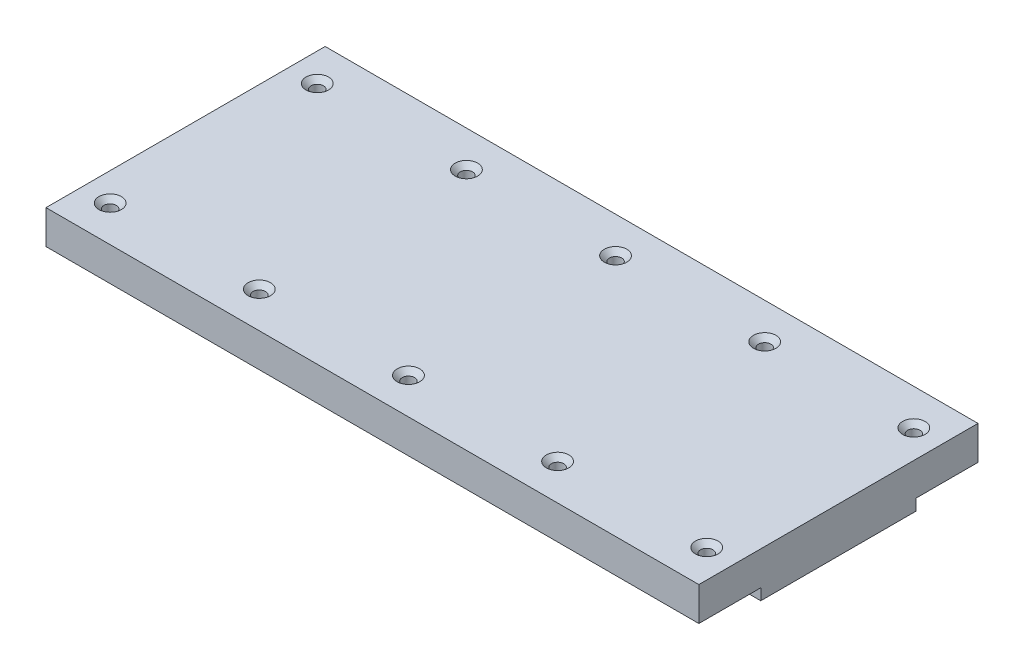
ISO-10303-21;
HEADER;
FILE_DESCRIPTION(('STEP AP214'),'2;1');
FILE_NAME('part.step','',(''),(''),'','','');
FILE_SCHEMA(('AUTOMOTIVE_DESIGN { 1 0 10303 214 1 1 1 1 }'));
ENDSEC;
DATA;
#1=APPLICATION_CONTEXT('core data for automotive mechanical design processes');
#2=APPLICATION_PROTOCOL_DEFINITION('international standard','automotive_design',2000,#1);
#3=PRODUCT_CONTEXT('',#1,'mechanical');
#4=PRODUCT('Part','Part','',(#3));
#5=PRODUCT_RELATED_PRODUCT_CATEGORY('part','',(#4));
#6=PRODUCT_DEFINITION_FORMATION('','',#4);
#7=PRODUCT_DEFINITION_CONTEXT('part definition',#1,'design');
#8=PRODUCT_DEFINITION('design','',#6,#7);
#9=PRODUCT_DEFINITION_SHAPE('','',#8);
#10=(LENGTH_UNIT() NAMED_UNIT(*) SI_UNIT(.MILLI.,.METRE.));
#11=(NAMED_UNIT(*) PLANE_ANGLE_UNIT() SI_UNIT($,.RADIAN.));
#12=(NAMED_UNIT(*) SI_UNIT($,.STERADIAN.) SOLID_ANGLE_UNIT());
#13=UNCERTAINTY_MEASURE_WITH_UNIT(LENGTH_MEASURE(1.E-05),#10,'distance_accuracy_value','');
#14=(GEOMETRIC_REPRESENTATION_CONTEXT(3) GLOBAL_UNCERTAINTY_ASSIGNED_CONTEXT((#13)) GLOBAL_UNIT_ASSIGNED_CONTEXT((#10,
#11,#12)) REPRESENTATION_CONTEXT('',''));
#15=CARTESIAN_POINT('',(0.,0.,0.));
#16=DIRECTION('',(0.,0.,1.));
#17=DIRECTION('',(1.,0.,0.));
#18=AXIS2_PLACEMENT_3D('',#15,#16,#17);
#19=CARTESIAN_POINT('',(290.,-30.,-124.));
#20=DIRECTION('',(0.,1.,0.));
#21=DIRECTION('',(0.,0.,1.));
#22=AXIS2_PLACEMENT_3D('',#19,#20,#21);
#23=PLANE('',#22);
#24=CARTESIAN_POINT('',(-265.,-30.,-92.));
#25=DIRECTION('',(0.,1.,0.));
#26=DIRECTION('',(0.,0.,1.));
#27=AXIS2_PLACEMENT_3D('',#24,#25,#26);
#28=CIRCLE('',#27,5.50000000000001);
#29=CARTESIAN_POINT('',(-265.,-30.,-86.5));
#30=VERTEX_POINT('',#29);
#31=EDGE_CURVE('E42',#30,#30,#28,.T.);
#32=ORIENTED_EDGE('',*,*,#31,.T.);
#33=EDGE_LOOP('',(#32));
#34=FACE_BOUND('',#33,.T.);
#35=CARTESIAN_POINT('',(-132.5,-30.,-92.));
#36=DIRECTION('',(0.,1.,0.));
#37=DIRECTION('',(0.,0.,1.));
#38=AXIS2_PLACEMENT_3D('',#35,#36,#37);
#39=CIRCLE('',#38,5.49999999999999);
#40=CARTESIAN_POINT('',(-132.5,-30.,-86.5));
#41=VERTEX_POINT('',#40);
#42=EDGE_CURVE('E228',#41,#41,#39,.T.);
#43=ORIENTED_EDGE('',*,*,#42,.T.);
#44=EDGE_LOOP('',(#43));
#45=FACE_BOUND('',#44,.T.);
#46=CARTESIAN_POINT('',(0.,-30.,-92.));
#47=DIRECTION('',(0.,1.,0.));
#48=DIRECTION('',(0.,0.,1.));
#49=AXIS2_PLACEMENT_3D('',#46,#47,#48);
#50=CIRCLE('',#49,5.49999999999999);
#51=CARTESIAN_POINT('',(0.,-30.,-86.5));
#52=VERTEX_POINT('',#51);
#53=EDGE_CURVE('E223',#52,#52,#50,.T.);
#54=ORIENTED_EDGE('',*,*,#53,.T.);
#55=EDGE_LOOP('',(#54));
#56=FACE_BOUND('',#55,.T.);
#57=CARTESIAN_POINT('',(132.5,-30.,-92.));
#58=DIRECTION('',(0.,1.,0.));
#59=DIRECTION('',(0.,0.,1.));
#60=AXIS2_PLACEMENT_3D('',#57,#58,#59);
#61=CIRCLE('',#60,5.49999999999999);
#62=CARTESIAN_POINT('',(132.5,-30.,-86.5));
#63=VERTEX_POINT('',#62);
#64=EDGE_CURVE('E217',#63,#63,#61,.T.);
#65=ORIENTED_EDGE('',*,*,#64,.T.);
#66=EDGE_LOOP('',(#65));
#67=FACE_BOUND('',#66,.T.);
#68=CARTESIAN_POINT('',(265.,-30.,-92.));
#69=DIRECTION('',(0.,1.,0.));
#70=DIRECTION('',(0.,0.,1.));
#71=AXIS2_PLACEMENT_3D('',#68,#69,#70);
#72=CIRCLE('',#71,5.50000000000001);
#73=CARTESIAN_POINT('',(265.,-30.,-86.5));
#74=VERTEX_POINT('',#73);
#75=EDGE_CURVE('E211',#74,#74,#72,.T.);
#76=ORIENTED_EDGE('',*,*,#75,.T.);
#77=EDGE_LOOP('',(#76));
#78=FACE_BOUND('',#77,.T.);
#79=DIRECTION('',(0.,0.,-1.));
#80=VECTOR('',#79,1.);
#81=CARTESIAN_POINT('',(-290.,-30.,-124.));
#82=LINE('',#81,#80);
#83=CARTESIAN_POINT('',(-290.,-30.,-69.));
#84=VERTEX_POINT('',#83);
#85=CARTESIAN_POINT('',(-290.,-30.,-124.));
#86=VERTEX_POINT('',#85);
#87=EDGE_CURVE('E142',#84,#86,#82,.T.);
#88=ORIENTED_EDGE('',*,*,#87,.T.);
#89=DIRECTION('',(-1.,0.,0.));
#90=VECTOR('',#89,1.);
#91=CARTESIAN_POINT('',(290.,-30.,-124.));
#92=LINE('',#91,#90);
#93=CARTESIAN_POINT('',(290.,-30.,-124.));
#94=VERTEX_POINT('',#93);
#95=EDGE_CURVE('E11',#94,#86,#92,.T.);
#96=ORIENTED_EDGE('',*,*,#95,.F.);
#97=DIRECTION('',(0.,0.,-1.));
#98=VECTOR('',#97,1.);
#99=CARTESIAN_POINT('',(290.,-30.,-124.));
#100=LINE('',#99,#98);
#101=CARTESIAN_POINT('',(290.,-30.,-69.));
#102=VERTEX_POINT('',#101);
#103=EDGE_CURVE('E165',#102,#94,#100,.T.);
#104=ORIENTED_EDGE('',*,*,#103,.F.);
#105=DIRECTION('',(-1.,0.,0.));
#106=VECTOR('',#105,1.);
#107=CARTESIAN_POINT('',(290.,-30.,-69.));
#108=LINE('',#107,#106);
#109=EDGE_CURVE('E138',#102,#84,#108,.T.);
#110=ORIENTED_EDGE('',*,*,#109,.T.);
#111=EDGE_LOOP('',(#88,#96,#104,#110));
#112=FACE_BOUND('',#111,.T.);
#113=ADVANCED_FACE('F39',(#34,#45,#56,#67,#78,#112),#23,.F.);
#114=CARTESIAN_POINT('',(290.,0.,-124.));
#115=DIRECTION('',(0.,0.,1.));
#116=DIRECTION('',(1.,0.,0.));
#117=AXIS2_PLACEMENT_3D('',#114,#115,#116);
#118=PLANE('',#117);
#119=DIRECTION('',(0.,1.,0.));
#120=VECTOR('',#119,1.);
#121=CARTESIAN_POINT('',(-290.,0.,-124.));
#122=LINE('',#121,#120);
#123=CARTESIAN_POINT('',(-290.,0.,-124.));
#124=VERTEX_POINT('',#123);
#125=EDGE_CURVE('E146',#86,#124,#122,.T.);
#126=ORIENTED_EDGE('',*,*,#125,.T.);
#127=DIRECTION('',(-1.,0.,0.));
#128=VECTOR('',#127,1.);
#129=CARTESIAN_POINT('',(290.,0.,-124.));
#130=LINE('',#129,#128);
#131=CARTESIAN_POINT('',(290.,0.,-124.));
#132=VERTEX_POINT('',#131);
#133=EDGE_CURVE('E49',#132,#124,#130,.T.);
#134=ORIENTED_EDGE('',*,*,#133,.F.);
#135=DIRECTION('',(0.,1.,0.));
#136=VECTOR('',#135,1.);
#137=CARTESIAN_POINT('',(290.,0.,-124.));
#138=LINE('',#137,#136);
#139=EDGE_CURVE('E101',#94,#132,#138,.T.);
#140=ORIENTED_EDGE('',*,*,#139,.F.);
#141=ORIENTED_EDGE('',*,*,#95,.T.);
#142=EDGE_LOOP('',(#126,#134,#140,#141));
#143=FACE_BOUND('',#142,.T.);
#144=ADVANCED_FACE('F332',(#143),#118,.F.);
#145=CARTESIAN_POINT('',(290.,0.,124.));
#146=DIRECTION('',(0.,-1.,0.));
#147=DIRECTION('',(0.,0.,-1.));
#148=AXIS2_PLACEMENT_3D('',#145,#146,#147);
#149=PLANE('',#148);
#150=CARTESIAN_POINT('',(-265.,0.,-92.));
#151=DIRECTION('',(0.,1.,0.));
#152=DIRECTION('',(0.,0.,1.));
#153=AXIS2_PLACEMENT_3D('',#150,#151,#152);
#154=CIRCLE('',#153,10.);
#155=CARTESIAN_POINT('',(-265.,0.,-82.));
#156=VERTEX_POINT('',#155);
#157=EDGE_CURVE('E542',#156,#156,#154,.T.);
#158=ORIENTED_EDGE('',*,*,#157,.F.);
#159=EDGE_LOOP('',(#158));
#160=FACE_BOUND('',#159,.T.);
#161=CARTESIAN_POINT('',(-132.5,0.,-92.));
#162=DIRECTION('',(0.,1.,0.));
#163=DIRECTION('',(0.,0.,1.));
#164=AXIS2_PLACEMENT_3D('',#161,#162,#163);
#165=CIRCLE('',#164,9.99999999999999);
#166=CARTESIAN_POINT('',(-132.5,0.,-82.));
#167=VERTEX_POINT('',#166);
#168=EDGE_CURVE('E240',#167,#167,#165,.T.);
#169=ORIENTED_EDGE('',*,*,#168,.F.);
#170=EDGE_LOOP('',(#169));
#171=FACE_BOUND('',#170,.T.);
#172=CARTESIAN_POINT('',(0.,0.,-92.));
#173=DIRECTION('',(0.,1.,0.));
#174=DIRECTION('',(0.,0.,1.));
#175=AXIS2_PLACEMENT_3D('',#172,#173,#174);
#176=CIRCLE('',#175,10.);
#177=CARTESIAN_POINT('',(0.,0.,-82.));
#178=VERTEX_POINT('',#177);
#179=EDGE_CURVE('E231',#178,#178,#176,.T.);
#180=ORIENTED_EDGE('',*,*,#179,.F.);
#181=EDGE_LOOP('',(#180));
#182=FACE_BOUND('',#181,.T.);
#183=CARTESIAN_POINT('',(132.5,0.,-92.));
#184=DIRECTION('',(0.,1.,0.));
#185=DIRECTION('',(0.,0.,1.));
#186=AXIS2_PLACEMENT_3D('',#183,#184,#185);
#187=CIRCLE('',#186,10.);
#188=CARTESIAN_POINT('',(132.5,0.,-82.));
#189=VERTEX_POINT('',#188);
#190=EDGE_CURVE('E226',#189,#189,#187,.T.);
#191=ORIENTED_EDGE('',*,*,#190,.F.);
#192=EDGE_LOOP('',(#191));
#193=FACE_BOUND('',#192,.T.);
#194=CARTESIAN_POINT('',(265.,0.,-92.));
#195=DIRECTION('',(0.,1.,0.));
#196=DIRECTION('',(0.,0.,1.));
#197=AXIS2_PLACEMENT_3D('',#194,#195,#196);
#198=CIRCLE('',#197,10.);
#199=CARTESIAN_POINT('',(265.,0.,-82.));
#200=VERTEX_POINT('',#199);
#201=EDGE_CURVE('E221',#200,#200,#198,.T.);
#202=ORIENTED_EDGE('',*,*,#201,.F.);
#203=EDGE_LOOP('',(#202));
#204=FACE_BOUND('',#203,.T.);
#205=CARTESIAN_POINT('',(265.,0.,92.));
#206=DIRECTION('',(0.,1.,0.));
#207=DIRECTION('',(0.,0.,1.));
#208=AXIS2_PLACEMENT_3D('',#205,#206,#207);
#209=CIRCLE('',#208,10.);
#210=CARTESIAN_POINT('',(265.,0.,102.));
#211=VERTEX_POINT('',#210);
#212=EDGE_CURVE('E215',#211,#211,#209,.T.);
#213=ORIENTED_EDGE('',*,*,#212,.F.);
#214=EDGE_LOOP('',(#213));
#215=FACE_BOUND('',#214,.T.);
#216=CARTESIAN_POINT('',(132.5,0.,92.));
#217=DIRECTION('',(0.,1.,0.));
#218=DIRECTION('',(0.,0.,1.));
#219=AXIS2_PLACEMENT_3D('',#216,#217,#218);
#220=CIRCLE('',#219,10.);
#221=CARTESIAN_POINT('',(132.5,0.,102.));
#222=VERTEX_POINT('',#221);
#223=EDGE_CURVE('E209',#222,#222,#220,.T.);
#224=ORIENTED_EDGE('',*,*,#223,.F.);
#225=EDGE_LOOP('',(#224));
#226=FACE_BOUND('',#225,.T.);
#227=CARTESIAN_POINT('',(0.,0.,92.));
#228=DIRECTION('',(0.,1.,0.));
#229=DIRECTION('',(0.,0.,1.));
#230=AXIS2_PLACEMENT_3D('',#227,#228,#229);
#231=CIRCLE('',#230,10.);
#232=CARTESIAN_POINT('',(0.,0.,102.));
#233=VERTEX_POINT('',#232);
#234=EDGE_CURVE('E203',#233,#233,#231,.T.);
#235=ORIENTED_EDGE('',*,*,#234,.F.);
#236=EDGE_LOOP('',(#235));
#237=FACE_BOUND('',#236,.T.);
#238=CARTESIAN_POINT('',(-132.5,0.,92.));
#239=DIRECTION('',(0.,1.,0.));
#240=DIRECTION('',(0.,0.,1.));
#241=AXIS2_PLACEMENT_3D('',#238,#239,#240);
#242=CIRCLE('',#241,9.99999999999999);
#243=CARTESIAN_POINT('',(-132.5,0.,102.));
#244=VERTEX_POINT('',#243);
#245=EDGE_CURVE('E197',#244,#244,#242,.T.);
#246=ORIENTED_EDGE('',*,*,#245,.F.);
#247=EDGE_LOOP('',(#246));
#248=FACE_BOUND('',#247,.T.);
#249=CARTESIAN_POINT('',(-265.,0.,92.));
#250=DIRECTION('',(0.,1.,0.));
#251=DIRECTION('',(0.,0.,1.));
#252=AXIS2_PLACEMENT_3D('',#249,#250,#251);
#253=CIRCLE('',#252,10.);
#254=CARTESIAN_POINT('',(-265.,0.,102.));
#255=VERTEX_POINT('',#254);
#256=EDGE_CURVE('E191',#255,#255,#253,.T.);
#257=ORIENTED_EDGE('',*,*,#256,.F.);
#258=EDGE_LOOP('',(#257));
#259=FACE_BOUND('',#258,.T.);
#260=DIRECTION('',(0.,0.,1.));
#261=VECTOR('',#260,1.);
#262=CARTESIAN_POINT('',(-290.,0.,124.));
#263=LINE('',#262,#261);
#264=CARTESIAN_POINT('',(-290.,0.,124.));
#265=VERTEX_POINT('',#264);
#266=EDGE_CURVE('E150',#124,#265,#263,.T.);
#267=ORIENTED_EDGE('',*,*,#266,.T.);
#268=DIRECTION('',(-1.,0.,0.));
#269=VECTOR('',#268,1.);
#270=CARTESIAN_POINT('',(290.,0.,124.));
#271=LINE('',#270,#269);
#272=CARTESIAN_POINT('',(290.,0.,124.));
#273=VERTEX_POINT('',#272);
#274=EDGE_CURVE('E176',#273,#265,#271,.T.);
#275=ORIENTED_EDGE('',*,*,#274,.F.);
#276=DIRECTION('',(0.,0.,1.));
#277=VECTOR('',#276,1.);
#278=CARTESIAN_POINT('',(290.,0.,124.));
#279=LINE('',#278,#277);
#280=EDGE_CURVE('E298',#132,#273,#279,.T.);
#281=ORIENTED_EDGE('',*,*,#280,.F.);
#282=ORIENTED_EDGE('',*,*,#133,.T.);
#283=EDGE_LOOP('',(#267,#275,#281,#282));
#284=FACE_BOUND('',#283,.T.);
#285=ADVANCED_FACE('F337',(#160,#171,#182,#193,#204,#215,#226,#237,#248,#259,#284),#149,.F.);
#286=CARTESIAN_POINT('',(290.,-30.,124.));
#287=DIRECTION('',(0.,0.,-1.));
#288=DIRECTION('',(-1.,0.,0.));
#289=AXIS2_PLACEMENT_3D('',#286,#287,#288);
#290=PLANE('',#289);
#291=DIRECTION('',(0.,-1.,0.));
#292=VECTOR('',#291,1.);
#293=CARTESIAN_POINT('',(-290.,-30.,124.));
#294=LINE('',#293,#292);
#295=CARTESIAN_POINT('',(-290.,-30.,124.));
#296=VERTEX_POINT('',#295);
#297=EDGE_CURVE('E153',#265,#296,#294,.T.);
#298=ORIENTED_EDGE('',*,*,#297,.T.);
#299=DIRECTION('',(-1.,0.,0.));
#300=VECTOR('',#299,1.);
#301=CARTESIAN_POINT('',(290.,-30.,124.));
#302=LINE('',#301,#300);
#303=CARTESIAN_POINT('',(290.,-30.,124.));
#304=VERTEX_POINT('',#303);
#305=EDGE_CURVE('E172',#304,#296,#302,.T.);
#306=ORIENTED_EDGE('',*,*,#305,.F.);
#307=DIRECTION('',(0.,-1.,0.));
#308=VECTOR('',#307,1.);
#309=CARTESIAN_POINT('',(290.,-30.,124.));
#310=LINE('',#309,#308);
#311=EDGE_CURVE('E301',#273,#304,#310,.T.);
#312=ORIENTED_EDGE('',*,*,#311,.F.);
#313=ORIENTED_EDGE('',*,*,#274,.T.);
#314=EDGE_LOOP('',(#298,#306,#312,#313));
#315=FACE_BOUND('',#314,.T.);
#316=ADVANCED_FACE('F309',(#315),#290,.F.);
#317=CARTESIAN_POINT('',(290.,-30.,69.));
#318=DIRECTION('',(0.,1.,0.));
#319=DIRECTION('',(0.,0.,1.));
#320=AXIS2_PLACEMENT_3D('',#317,#318,#319);
#321=PLANE('',#320);
#322=CARTESIAN_POINT('',(265.,-30.,92.));
#323=DIRECTION('',(0.,1.,0.));
#324=DIRECTION('',(0.,0.,1.));
#325=AXIS2_PLACEMENT_3D('',#322,#323,#324);
#326=CIRCLE('',#325,5.50000000000001);
#327=CARTESIAN_POINT('',(265.,-30.,97.5));
#328=VERTEX_POINT('',#327);
#329=EDGE_CURVE('E205',#328,#328,#326,.T.);
#330=ORIENTED_EDGE('',*,*,#329,.T.);
#331=EDGE_LOOP('',(#330));
#332=FACE_BOUND('',#331,.T.);
#333=CARTESIAN_POINT('',(132.5,-30.,92.));
#334=DIRECTION('',(0.,1.,0.));
#335=DIRECTION('',(0.,0.,1.));
#336=AXIS2_PLACEMENT_3D('',#333,#334,#335);
#337=CIRCLE('',#336,5.49999999999999);
#338=CARTESIAN_POINT('',(132.5,-30.,97.5));
#339=VERTEX_POINT('',#338);
#340=EDGE_CURVE('E199',#339,#339,#337,.T.);
#341=ORIENTED_EDGE('',*,*,#340,.T.);
#342=EDGE_LOOP('',(#341));
#343=FACE_BOUND('',#342,.T.);
#344=CARTESIAN_POINT('',(0.,-30.,92.));
#345=DIRECTION('',(0.,1.,0.));
#346=DIRECTION('',(0.,0.,1.));
#347=AXIS2_PLACEMENT_3D('',#344,#345,#346);
#348=CIRCLE('',#347,5.49999999999999);
#349=CARTESIAN_POINT('',(0.,-30.,97.5));
#350=VERTEX_POINT('',#349);
#351=EDGE_CURVE('E193',#350,#350,#348,.T.);
#352=ORIENTED_EDGE('',*,*,#351,.T.);
#353=EDGE_LOOP('',(#352));
#354=FACE_BOUND('',#353,.T.);
#355=CARTESIAN_POINT('',(-132.5,-30.,92.));
#356=DIRECTION('',(0.,1.,0.));
#357=DIRECTION('',(0.,0.,1.));
#358=AXIS2_PLACEMENT_3D('',#355,#356,#357);
#359=CIRCLE('',#358,5.49999999999999);
#360=CARTESIAN_POINT('',(-132.5,-30.,97.5));
#361=VERTEX_POINT('',#360);
#362=EDGE_CURVE('E187',#361,#361,#359,.T.);
#363=ORIENTED_EDGE('',*,*,#362,.T.);
#364=EDGE_LOOP('',(#363));
#365=FACE_BOUND('',#364,.T.);
#366=CARTESIAN_POINT('',(-265.,-30.,92.));
#367=DIRECTION('',(0.,1.,0.));
#368=DIRECTION('',(0.,0.,1.));
#369=AXIS2_PLACEMENT_3D('',#366,#367,#368);
#370=CIRCLE('',#369,5.50000000000001);
#371=CARTESIAN_POINT('',(-265.,-30.,97.5));
#372=VERTEX_POINT('',#371);
#373=EDGE_CURVE('E147',#372,#372,#370,.T.);
#374=ORIENTED_EDGE('',*,*,#373,.T.);
#375=EDGE_LOOP('',(#374));
#376=FACE_BOUND('',#375,.T.);
#377=DIRECTION('',(0.,0.,-1.));
#378=VECTOR('',#377,1.);
#379=CARTESIAN_POINT('',(-290.,-30.,69.));
#380=LINE('',#379,#378);
#381=CARTESIAN_POINT('',(-290.,-30.,69.));
#382=VERTEX_POINT('',#381);
#383=EDGE_CURVE('E156',#296,#382,#380,.T.);
#384=ORIENTED_EDGE('',*,*,#383,.T.);
#385=DIRECTION('',(-1.,0.,0.));
#386=VECTOR('',#385,1.);
#387=CARTESIAN_POINT('',(290.,-30.,69.));
#388=LINE('',#387,#386);
#389=CARTESIAN_POINT('',(290.,-30.,69.));
#390=VERTEX_POINT('',#389);
#391=EDGE_CURVE('E131',#390,#382,#388,.T.);
#392=ORIENTED_EDGE('',*,*,#391,.F.);
#393=DIRECTION('',(0.,0.,-1.));
#394=VECTOR('',#393,1.);
#395=CARTESIAN_POINT('',(290.,-30.,69.));
#396=LINE('',#395,#394);
#397=EDGE_CURVE('E120',#304,#390,#396,.T.);
#398=ORIENTED_EDGE('',*,*,#397,.F.);
#399=ORIENTED_EDGE('',*,*,#305,.T.);
#400=EDGE_LOOP('',(#384,#392,#398,#399));
#401=FACE_BOUND('',#400,.T.);
#402=ADVANCED_FACE('F313',(#332,#343,#354,#365,#376,#401),#321,.F.);
#403=CARTESIAN_POINT('',(290.,-40.,69.));
#404=DIRECTION('',(0.,0.,-1.));
#405=DIRECTION('',(-1.,0.,0.));
#406=AXIS2_PLACEMENT_3D('',#403,#404,#405);
#407=PLANE('',#406);
#408=DIRECTION('',(0.,-1.,0.));
#409=VECTOR('',#408,1.);
#410=CARTESIAN_POINT('',(-290.,-40.,69.));
#411=LINE('',#410,#409);
#412=CARTESIAN_POINT('',(-290.,-40.,69.));
#413=VERTEX_POINT('',#412);
#414=EDGE_CURVE('E129',#382,#413,#411,.T.);
#415=ORIENTED_EDGE('',*,*,#414,.T.);
#416=DIRECTION('',(-1.,0.,0.));
#417=VECTOR('',#416,1.);
#418=CARTESIAN_POINT('',(290.,-40.,69.));
#419=LINE('',#418,#417);
#420=CARTESIAN_POINT('',(290.,-40.,69.));
#421=VERTEX_POINT('',#420);
#422=EDGE_CURVE('E126',#421,#413,#419,.T.);
#423=ORIENTED_EDGE('',*,*,#422,.F.);
#424=DIRECTION('',(0.,-1.,0.));
#425=VECTOR('',#424,1.);
#426=CARTESIAN_POINT('',(290.,-40.,69.));
#427=LINE('',#426,#425);
#428=EDGE_CURVE('E114',#390,#421,#427,.T.);
#429=ORIENTED_EDGE('',*,*,#428,.F.);
#430=ORIENTED_EDGE('',*,*,#391,.T.);
#431=EDGE_LOOP('',(#415,#423,#429,#430));
#432=FACE_BOUND('',#431,.T.);
#433=ADVANCED_FACE('F127',(#432),#407,.F.);
#434=CARTESIAN_POINT('',(290.,-40.,-69.));
#435=DIRECTION('',(0.,1.,0.));
#436=DIRECTION('',(0.,0.,1.));
#437=AXIS2_PLACEMENT_3D('',#434,#435,#436);
#438=PLANE('',#437);
#439=DIRECTION('',(0.,0.,-1.));
#440=VECTOR('',#439,1.);
#441=CARTESIAN_POINT('',(-290.,-40.,-69.));
#442=LINE('',#441,#440);
#443=CARTESIAN_POINT('',(-290.,-40.,-69.));
#444=VERTEX_POINT('',#443);
#445=EDGE_CURVE('E87',#413,#444,#442,.T.);
#446=ORIENTED_EDGE('',*,*,#445,.T.);
#447=DIRECTION('',(-1.,0.,0.));
#448=VECTOR('',#447,1.);
#449=CARTESIAN_POINT('',(290.,-40.,-69.));
#450=LINE('',#449,#448);
#451=CARTESIAN_POINT('',(290.,-40.,-69.));
#452=VERTEX_POINT('',#451);
#453=EDGE_CURVE('E132',#452,#444,#450,.T.);
#454=ORIENTED_EDGE('',*,*,#453,.F.);
#455=DIRECTION('',(0.,0.,-1.));
#456=VECTOR('',#455,1.);
#457=CARTESIAN_POINT('',(290.,-40.,-69.));
#458=LINE('',#457,#456);
#459=EDGE_CURVE('E118',#421,#452,#458,.T.);
#460=ORIENTED_EDGE('',*,*,#459,.F.);
#461=ORIENTED_EDGE('',*,*,#422,.T.);
#462=EDGE_LOOP('',(#446,#454,#460,#461));
#463=FACE_BOUND('',#462,.T.);
#464=ADVANCED_FACE('F134',(#463),#438,.F.);
#465=CARTESIAN_POINT('',(290.,-30.,-69.));
#466=DIRECTION('',(0.,0.,1.));
#467=DIRECTION('',(1.,0.,0.));
#468=AXIS2_PLACEMENT_3D('',#465,#466,#467);
#469=PLANE('',#468);
#470=DIRECTION('',(0.,1.,0.));
#471=VECTOR('',#470,1.);
#472=CARTESIAN_POINT('',(-290.,-30.,-69.));
#473=LINE('',#472,#471);
#474=EDGE_CURVE('E93',#444,#84,#473,.T.);
#475=ORIENTED_EDGE('',*,*,#474,.T.);
#476=ORIENTED_EDGE('',*,*,#109,.F.);
#477=DIRECTION('',(0.,1.,0.));
#478=VECTOR('',#477,1.);
#479=CARTESIAN_POINT('',(290.,-30.,-69.));
#480=LINE('',#479,#478);
#481=EDGE_CURVE('E58',#452,#102,#480,.T.);
#482=ORIENTED_EDGE('',*,*,#481,.F.);
#483=ORIENTED_EDGE('',*,*,#453,.T.);
#484=EDGE_LOOP('',(#475,#476,#482,#483));
#485=FACE_BOUND('',#484,.T.);
#486=ADVANCED_FACE('F321',(#485),#469,.F.);
#487=CARTESIAN_POINT('',(290.,0.,0.));
#488=DIRECTION('',(1.,0.,0.));
#489=DIRECTION('',(0.,0.,-1.));
#490=AXIS2_PLACEMENT_3D('',#487,#488,#489);
#491=PLANE('',#490);
#492=ORIENTED_EDGE('',*,*,#103,.T.);
#493=ORIENTED_EDGE('',*,*,#139,.T.);
#494=ORIENTED_EDGE('',*,*,#280,.T.);
#495=ORIENTED_EDGE('',*,*,#311,.T.);
#496=ORIENTED_EDGE('',*,*,#397,.T.);
#497=ORIENTED_EDGE('',*,*,#428,.T.);
#498=ORIENTED_EDGE('',*,*,#459,.T.);
#499=ORIENTED_EDGE('',*,*,#481,.T.);
#500=EDGE_LOOP('',(#492,#493,#494,#495,#496,#497,#498,#499));
#501=FACE_BOUND('',#500,.T.);
#502=ADVANCED_FACE('F116',(#501),#491,.T.);
#503=CARTESIAN_POINT('',(-290.,0.,0.));
#504=DIRECTION('',(1.,0.,0.));
#505=DIRECTION('',(0.,0.,-1.));
#506=AXIS2_PLACEMENT_3D('',#503,#504,#505);
#507=PLANE('',#506);
#508=ORIENTED_EDGE('',*,*,#87,.F.);
#509=ORIENTED_EDGE('',*,*,#474,.F.);
#510=ORIENTED_EDGE('',*,*,#445,.F.);
#511=ORIENTED_EDGE('',*,*,#414,.F.);
#512=ORIENTED_EDGE('',*,*,#383,.F.);
#513=ORIENTED_EDGE('',*,*,#297,.F.);
#514=ORIENTED_EDGE('',*,*,#266,.F.);
#515=ORIENTED_EDGE('',*,*,#125,.F.);
#516=EDGE_LOOP('',(#508,#509,#510,#511,#512,#513,#514,#515));
#517=FACE_BOUND('',#516,.T.);
#518=ADVANCED_FACE('F316',(#517),#507,.F.);
#519=CARTESIAN_POINT('',(-265.,0.,92.));
#520=DIRECTION('',(0.,1.,0.));
#521=DIRECTION('',(0.,0.,1.));
#522=AXIS2_PLACEMENT_3D('',#519,#520,#521);
#523=CYLINDRICAL_SURFACE('',#522,5.50000000000001);
#524=CARTESIAN_POINT('',(-265.,-4.49999999999999,92.));
#525=DIRECTION('',(0.,1.,0.));
#526=DIRECTION('',(0.,0.,1.));
#527=AXIS2_PLACEMENT_3D('',#524,#525,#526);
#528=CIRCLE('',#527,5.50000000000001);
#529=CARTESIAN_POINT('',(-265.,-4.49999999999999,97.5));
#530=VERTEX_POINT('',#529);
#531=EDGE_CURVE('E186',#530,#530,#528,.T.);
#532=ORIENTED_EDGE('',*,*,#531,.T.);
#533=EDGE_LOOP('',(#532));
#534=FACE_BOUND('',#533,.T.);
#535=ORIENTED_EDGE('',*,*,#373,.F.);
#536=EDGE_LOOP('',(#535));
#537=FACE_BOUND('',#536,.T.);
#538=ADVANCED_FACE('F395',(#534,#537),#523,.F.);
#539=CARTESIAN_POINT('',(-265.,0.,92.));
#540=DIRECTION('',(0.,1.,0.));
#541=DIRECTION('',(0.,0.,1.));
#542=AXIS2_PLACEMENT_3D('',#539,#540,#541);
#543=CONICAL_SURFACE('',#542,10.,0.78539816339745);
#544=ORIENTED_EDGE('',*,*,#531,.F.);
#545=EDGE_LOOP('',(#544));
#546=FACE_BOUND('',#545,.T.);
#547=ORIENTED_EDGE('',*,*,#256,.T.);
#548=EDGE_LOOP('',(#547));
#549=FACE_BOUND('',#548,.T.);
#550=ADVANCED_FACE('F391',(#546,#549),#543,.F.);
#551=CARTESIAN_POINT('',(-132.5,0.,92.));
#552=DIRECTION('',(0.,1.,0.));
#553=DIRECTION('',(0.,0.,1.));
#554=AXIS2_PLACEMENT_3D('',#551,#552,#553);
#555=CYLINDRICAL_SURFACE('',#554,5.49999999999999);
#556=CARTESIAN_POINT('',(-132.5,-4.49999999999999,92.));
#557=DIRECTION('',(0.,1.,0.));
#558=DIRECTION('',(0.,0.,1.));
#559=AXIS2_PLACEMENT_3D('',#556,#557,#558);
#560=CIRCLE('',#559,5.50000000000001);
#561=CARTESIAN_POINT('',(-132.5,-4.49999999999999,97.5));
#562=VERTEX_POINT('',#561);
#563=EDGE_CURVE('E192',#562,#562,#560,.T.);
#564=ORIENTED_EDGE('',*,*,#563,.T.);
#565=EDGE_LOOP('',(#564));
#566=FACE_BOUND('',#565,.T.);
#567=ORIENTED_EDGE('',*,*,#362,.F.);
#568=EDGE_LOOP('',(#567));
#569=FACE_BOUND('',#568,.T.);
#570=ADVANCED_FACE('F387',(#566,#569),#555,.F.);
#571=CARTESIAN_POINT('',(-132.5,0.,92.));
#572=DIRECTION('',(0.,1.,0.));
#573=DIRECTION('',(0.,0.,1.));
#574=AXIS2_PLACEMENT_3D('',#571,#572,#573);
#575=CONICAL_SURFACE('',#574,9.99999999999999,0.785398163397448);
#576=ORIENTED_EDGE('',*,*,#563,.F.);
#577=EDGE_LOOP('',(#576));
#578=FACE_BOUND('',#577,.T.);
#579=ORIENTED_EDGE('',*,*,#245,.T.);
#580=EDGE_LOOP('',(#579));
#581=FACE_BOUND('',#580,.T.);
#582=ADVANCED_FACE('F383',(#578,#581),#575,.F.);
#583=CARTESIAN_POINT('',(0.,0.,92.));
#584=DIRECTION('',(0.,1.,0.));
#585=DIRECTION('',(0.,0.,1.));
#586=AXIS2_PLACEMENT_3D('',#583,#584,#585);
#587=CYLINDRICAL_SURFACE('',#586,5.49999999999999);
#588=CARTESIAN_POINT('',(0.,-4.49999999999999,92.));
#589=DIRECTION('',(0.,1.,0.));
#590=DIRECTION('',(0.,0.,1.));
#591=AXIS2_PLACEMENT_3D('',#588,#589,#590);
#592=CIRCLE('',#591,5.49999999999999);
#593=CARTESIAN_POINT('',(0.,-4.49999999999999,97.5));
#594=VERTEX_POINT('',#593);
#595=EDGE_CURVE('E198',#594,#594,#592,.T.);
#596=ORIENTED_EDGE('',*,*,#595,.T.);
#597=EDGE_LOOP('',(#596));
#598=FACE_BOUND('',#597,.T.);
#599=ORIENTED_EDGE('',*,*,#351,.F.);
#600=EDGE_LOOP('',(#599));
#601=FACE_BOUND('',#600,.T.);
#602=ADVANCED_FACE('F379',(#598,#601),#587,.F.);
#603=CARTESIAN_POINT('',(0.,0.,92.));
#604=DIRECTION('',(0.,1.,0.));
#605=DIRECTION('',(0.,0.,1.));
#606=AXIS2_PLACEMENT_3D('',#603,#604,#605);
#607=CONICAL_SURFACE('',#606,10.,0.78539816339745);
#608=ORIENTED_EDGE('',*,*,#595,.F.);
#609=EDGE_LOOP('',(#608));
#610=FACE_BOUND('',#609,.T.);
#611=ORIENTED_EDGE('',*,*,#234,.T.);
#612=EDGE_LOOP('',(#611));
#613=FACE_BOUND('',#612,.T.);
#614=ADVANCED_FACE('F375',(#610,#613),#607,.F.);
#615=CARTESIAN_POINT('',(132.5,0.,92.));
#616=DIRECTION('',(0.,1.,0.));
#617=DIRECTION('',(0.,0.,1.));
#618=AXIS2_PLACEMENT_3D('',#615,#616,#617);
#619=CYLINDRICAL_SURFACE('',#618,5.49999999999999);
#620=CARTESIAN_POINT('',(132.5,-4.49999999999999,92.));
#621=DIRECTION('',(0.,1.,0.));
#622=DIRECTION('',(0.,0.,1.));
#623=AXIS2_PLACEMENT_3D('',#620,#621,#622);
#624=CIRCLE('',#623,5.50000000000001);
#625=CARTESIAN_POINT('',(132.5,-4.49999999999999,97.5));
#626=VERTEX_POINT('',#625);
#627=EDGE_CURVE('E204',#626,#626,#624,.T.);
#628=ORIENTED_EDGE('',*,*,#627,.T.);
#629=EDGE_LOOP('',(#628));
#630=FACE_BOUND('',#629,.T.);
#631=ORIENTED_EDGE('',*,*,#340,.F.);
#632=EDGE_LOOP('',(#631));
#633=FACE_BOUND('',#632,.T.);
#634=ADVANCED_FACE('F371',(#630,#633),#619,.F.);
#635=CARTESIAN_POINT('',(132.5,0.,92.));
#636=DIRECTION('',(0.,1.,0.));
#637=DIRECTION('',(0.,0.,1.));
#638=AXIS2_PLACEMENT_3D('',#635,#636,#637);
#639=CONICAL_SURFACE('',#638,10.,0.78539816339745);
#640=ORIENTED_EDGE('',*,*,#627,.F.);
#641=EDGE_LOOP('',(#640));
#642=FACE_BOUND('',#641,.T.);
#643=ORIENTED_EDGE('',*,*,#223,.T.);
#644=EDGE_LOOP('',(#643));
#645=FACE_BOUND('',#644,.T.);
#646=ADVANCED_FACE('F367',(#642,#645),#639,.F.);
#647=CARTESIAN_POINT('',(265.,0.,92.));
#648=DIRECTION('',(0.,1.,0.));
#649=DIRECTION('',(0.,0.,1.));
#650=AXIS2_PLACEMENT_3D('',#647,#648,#649);
#651=CYLINDRICAL_SURFACE('',#650,5.50000000000001);
#652=CARTESIAN_POINT('',(265.,-4.49999999999999,92.));
#653=DIRECTION('',(0.,1.,0.));
#654=DIRECTION('',(0.,0.,1.));
#655=AXIS2_PLACEMENT_3D('',#652,#653,#654);
#656=CIRCLE('',#655,5.50000000000001);
#657=CARTESIAN_POINT('',(265.,-4.49999999999999,97.5));
#658=VERTEX_POINT('',#657);
#659=EDGE_CURVE('E210',#658,#658,#656,.T.);
#660=ORIENTED_EDGE('',*,*,#659,.T.);
#661=EDGE_LOOP('',(#660));
#662=FACE_BOUND('',#661,.T.);
#663=ORIENTED_EDGE('',*,*,#329,.F.);
#664=EDGE_LOOP('',(#663));
#665=FACE_BOUND('',#664,.T.);
#666=ADVANCED_FACE('F360',(#662,#665),#651,.F.);
#667=CARTESIAN_POINT('',(265.,0.,92.));
#668=DIRECTION('',(0.,1.,0.));
#669=DIRECTION('',(0.,0.,1.));
#670=AXIS2_PLACEMENT_3D('',#667,#668,#669);
#671=CONICAL_SURFACE('',#670,10.,0.78539816339745);
#672=ORIENTED_EDGE('',*,*,#659,.F.);
#673=EDGE_LOOP('',(#672));
#674=FACE_BOUND('',#673,.T.);
#675=ORIENTED_EDGE('',*,*,#212,.T.);
#676=EDGE_LOOP('',(#675));
#677=FACE_BOUND('',#676,.T.);
#678=ADVANCED_FACE('F350',(#674,#677),#671,.F.);
#679=CARTESIAN_POINT('',(265.,0.,-92.));
#680=DIRECTION('',(0.,1.,0.));
#681=DIRECTION('',(0.,0.,1.));
#682=AXIS2_PLACEMENT_3D('',#679,#680,#681);
#683=CYLINDRICAL_SURFACE('',#682,5.50000000000001);
#684=CARTESIAN_POINT('',(265.,-4.49999999999999,-92.));
#685=DIRECTION('',(0.,1.,0.));
#686=DIRECTION('',(0.,0.,1.));
#687=AXIS2_PLACEMENT_3D('',#684,#685,#686);
#688=CIRCLE('',#687,5.50000000000001);
#689=CARTESIAN_POINT('',(265.,-4.49999999999999,-86.5));
#690=VERTEX_POINT('',#689);
#691=EDGE_CURVE('E216',#690,#690,#688,.T.);
#692=ORIENTED_EDGE('',*,*,#691,.T.);
#693=EDGE_LOOP('',(#692));
#694=FACE_BOUND('',#693,.T.);
#695=ORIENTED_EDGE('',*,*,#75,.F.);
#696=EDGE_LOOP('',(#695));
#697=FACE_BOUND('',#696,.T.);
#698=ADVANCED_FACE('F347',(#694,#697),#683,.F.);
#699=CARTESIAN_POINT('',(265.,0.,-92.));
#700=DIRECTION('',(0.,1.,0.));
#701=DIRECTION('',(0.,0.,1.));
#702=AXIS2_PLACEMENT_3D('',#699,#700,#701);
#703=CONICAL_SURFACE('',#702,10.,0.78539816339745);
#704=ORIENTED_EDGE('',*,*,#691,.F.);
#705=EDGE_LOOP('',(#704));
#706=FACE_BOUND('',#705,.T.);
#707=ORIENTED_EDGE('',*,*,#201,.T.);
#708=EDGE_LOOP('',(#707));
#709=FACE_BOUND('',#708,.T.);
#710=ADVANCED_FACE('F349',(#706,#709),#703,.F.);
#711=CARTESIAN_POINT('',(132.5,0.,-92.));
#712=DIRECTION('',(0.,1.,0.));
#713=DIRECTION('',(0.,0.,1.));
#714=AXIS2_PLACEMENT_3D('',#711,#712,#713);
#715=CYLINDRICAL_SURFACE('',#714,5.49999999999999);
#716=CARTESIAN_POINT('',(132.5,-4.49999999999999,-92.));
#717=DIRECTION('',(0.,1.,0.));
#718=DIRECTION('',(0.,0.,1.));
#719=AXIS2_PLACEMENT_3D('',#716,#717,#718);
#720=CIRCLE('',#719,5.50000000000001);
#721=CARTESIAN_POINT('',(132.5,-4.49999999999999,-86.5));
#722=VERTEX_POINT('',#721);
#723=EDGE_CURVE('E222',#722,#722,#720,.T.);
#724=ORIENTED_EDGE('',*,*,#723,.T.);
#725=EDGE_LOOP('',(#724));
#726=FACE_BOUND('',#725,.T.);
#727=ORIENTED_EDGE('',*,*,#64,.F.);
#728=EDGE_LOOP('',(#727));
#729=FACE_BOUND('',#728,.T.);
#730=ADVANCED_FACE('F357',(#726,#729),#715,.F.);
#731=CARTESIAN_POINT('',(132.5,0.,-92.));
#732=DIRECTION('',(0.,1.,0.));
#733=DIRECTION('',(0.,0.,1.));
#734=AXIS2_PLACEMENT_3D('',#731,#732,#733);
#735=CONICAL_SURFACE('',#734,10.,0.78539816339745);
#736=ORIENTED_EDGE('',*,*,#723,.F.);
#737=EDGE_LOOP('',(#736));
#738=FACE_BOUND('',#737,.T.);
#739=ORIENTED_EDGE('',*,*,#190,.T.);
#740=EDGE_LOOP('',(#739));
#741=FACE_BOUND('',#740,.T.);
#742=ADVANCED_FACE('F464',(#738,#741),#735,.F.);
#743=CARTESIAN_POINT('',(0.,0.,-92.));
#744=DIRECTION('',(0.,1.,0.));
#745=DIRECTION('',(0.,0.,1.));
#746=AXIS2_PLACEMENT_3D('',#743,#744,#745);
#747=CYLINDRICAL_SURFACE('',#746,5.49999999999999);
#748=CARTESIAN_POINT('',(0.,-4.49999999999999,-92.));
#749=DIRECTION('',(0.,1.,0.));
#750=DIRECTION('',(0.,0.,1.));
#751=AXIS2_PLACEMENT_3D('',#748,#749,#750);
#752=CIRCLE('',#751,5.49999999999999);
#753=CARTESIAN_POINT('',(0.,-4.49999999999999,-86.5));
#754=VERTEX_POINT('',#753);
#755=EDGE_CURVE('E227',#754,#754,#752,.T.);
#756=ORIENTED_EDGE('',*,*,#755,.T.);
#757=EDGE_LOOP('',(#756));
#758=FACE_BOUND('',#757,.T.);
#759=ORIENTED_EDGE('',*,*,#53,.F.);
#760=EDGE_LOOP('',(#759));
#761=FACE_BOUND('',#760,.T.);
#762=ADVANCED_FACE('F473',(#758,#761),#747,.F.);
#763=CARTESIAN_POINT('',(0.,0.,-92.));
#764=DIRECTION('',(0.,1.,0.));
#765=DIRECTION('',(0.,0.,1.));
#766=AXIS2_PLACEMENT_3D('',#763,#764,#765);
#767=CONICAL_SURFACE('',#766,10.,0.78539816339745);
#768=ORIENTED_EDGE('',*,*,#755,.F.);
#769=EDGE_LOOP('',(#768));
#770=FACE_BOUND('',#769,.T.);
#771=ORIENTED_EDGE('',*,*,#179,.T.);
#772=EDGE_LOOP('',(#771));
#773=FACE_BOUND('',#772,.T.);
#774=ADVANCED_FACE('F483',(#770,#773),#767,.F.);
#775=CARTESIAN_POINT('',(-132.5,0.,-92.));
#776=DIRECTION('',(0.,1.,0.));
#777=DIRECTION('',(0.,0.,1.));
#778=AXIS2_PLACEMENT_3D('',#775,#776,#777);
#779=CYLINDRICAL_SURFACE('',#778,5.49999999999999);
#780=CARTESIAN_POINT('',(-132.5,-4.49999999999999,-92.));
#781=DIRECTION('',(0.,1.,0.));
#782=DIRECTION('',(0.,0.,1.));
#783=AXIS2_PLACEMENT_3D('',#780,#781,#782);
#784=CIRCLE('',#783,5.50000000000001);
#785=CARTESIAN_POINT('',(-132.5,-4.49999999999999,-86.5));
#786=VERTEX_POINT('',#785);
#787=EDGE_CURVE('E232',#786,#786,#784,.T.);
#788=ORIENTED_EDGE('',*,*,#787,.T.);
#789=EDGE_LOOP('',(#788));
#790=FACE_BOUND('',#789,.T.);
#791=ORIENTED_EDGE('',*,*,#42,.F.);
#792=EDGE_LOOP('',(#791));
#793=FACE_BOUND('',#792,.T.);
#794=ADVANCED_FACE('F493',(#790,#793),#779,.F.);
#795=CARTESIAN_POINT('',(-132.5,0.,-92.));
#796=DIRECTION('',(0.,1.,0.));
#797=DIRECTION('',(0.,0.,1.));
#798=AXIS2_PLACEMENT_3D('',#795,#796,#797);
#799=CONICAL_SURFACE('',#798,9.99999999999999,0.785398163397448);
#800=ORIENTED_EDGE('',*,*,#787,.F.);
#801=EDGE_LOOP('',(#800));
#802=FACE_BOUND('',#801,.T.);
#803=ORIENTED_EDGE('',*,*,#168,.T.);
#804=EDGE_LOOP('',(#803));
#805=FACE_BOUND('',#804,.T.);
#806=ADVANCED_FACE('F503',(#802,#805),#799,.F.);
#807=CARTESIAN_POINT('',(-265.,0.,-92.));
#808=DIRECTION('',(0.,1.,0.));
#809=DIRECTION('',(0.,0.,1.));
#810=AXIS2_PLACEMENT_3D('',#807,#808,#809);
#811=CYLINDRICAL_SURFACE('',#810,5.50000000000001);
#812=CARTESIAN_POINT('',(-265.,-4.49999999999999,-92.));
#813=DIRECTION('',(0.,1.,0.));
#814=DIRECTION('',(0.,0.,1.));
#815=AXIS2_PLACEMENT_3D('',#812,#813,#814);
#816=CIRCLE('',#815,5.50000000000001);
#817=CARTESIAN_POINT('',(-265.,-4.49999999999999,-86.5));
#818=VERTEX_POINT('',#817);
#819=EDGE_CURVE('E539',#818,#818,#816,.T.);
#820=ORIENTED_EDGE('',*,*,#819,.T.);
#821=EDGE_LOOP('',(#820));
#822=FACE_BOUND('',#821,.T.);
#823=ORIENTED_EDGE('',*,*,#31,.F.);
#824=EDGE_LOOP('',(#823));
#825=FACE_BOUND('',#824,.T.);
#826=ADVANCED_FACE('F512',(#822,#825),#811,.F.);
#827=CARTESIAN_POINT('',(-265.,0.,-92.));
#828=DIRECTION('',(0.,1.,0.));
#829=DIRECTION('',(0.,0.,1.));
#830=AXIS2_PLACEMENT_3D('',#827,#828,#829);
#831=CONICAL_SURFACE('',#830,10.,0.78539816339745);
#832=ORIENTED_EDGE('',*,*,#819,.F.);
#833=EDGE_LOOP('',(#832));
#834=FACE_BOUND('',#833,.T.);
#835=ORIENTED_EDGE('',*,*,#157,.T.);
#836=EDGE_LOOP('',(#835));
#837=FACE_BOUND('',#836,.T.);
#838=ADVANCED_FACE('F522',(#834,#837),#831,.F.);
#839=CLOSED_SHELL('',(#113,#144,#285,#316,#402,#433,#464,#486,#502,#518,#538,#550,#570,#582,
#602,#614,#634,#646,#666,#678,#698,#710,#730,#742,#762,#774,#794,#806,#826,#838));
#840=MANIFOLD_SOLID_BREP('B2',#839);
#841=ADVANCED_BREP_SHAPE_REPRESENTATION('',(#18,#840),#14);
#842=SHAPE_DEFINITION_REPRESENTATION(#9,#841);
ENDSEC;
END-ISO-10303-21;
